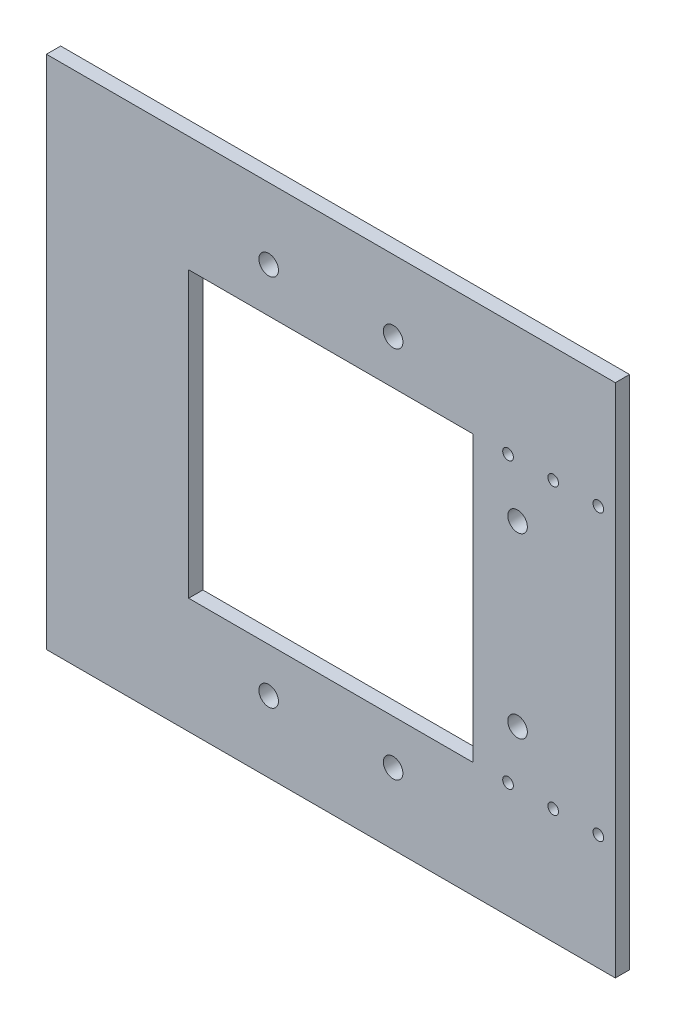
ISO-10303-21;
HEADER;
FILE_DESCRIPTION(('STEP AP214'),'2;1');
FILE_NAME('part.step','',(''),(''),'','','');
FILE_SCHEMA(('AUTOMOTIVE_DESIGN { 1 0 10303 214 1 1 1 1 }'));
ENDSEC;
DATA;
#1=APPLICATION_CONTEXT('core data for automotive mechanical design processes');
#2=APPLICATION_PROTOCOL_DEFINITION('international standard','automotive_design',2000,#1);
#3=PRODUCT_CONTEXT('',#1,'mechanical');
#4=PRODUCT('Part','Part','',(#3));
#5=PRODUCT_RELATED_PRODUCT_CATEGORY('part','',(#4));
#6=PRODUCT_DEFINITION_FORMATION('','',#4);
#7=PRODUCT_DEFINITION_CONTEXT('part definition',#1,'design');
#8=PRODUCT_DEFINITION('design','',#6,#7);
#9=PRODUCT_DEFINITION_SHAPE('','',#8);
#10=(LENGTH_UNIT() NAMED_UNIT(*) SI_UNIT(.MILLI.,.METRE.));
#11=(NAMED_UNIT(*) PLANE_ANGLE_UNIT() SI_UNIT($,.RADIAN.));
#12=(NAMED_UNIT(*) SI_UNIT($,.STERADIAN.) SOLID_ANGLE_UNIT());
#13=UNCERTAINTY_MEASURE_WITH_UNIT(LENGTH_MEASURE(1.E-05),#10,'distance_accuracy_value','');
#14=(GEOMETRIC_REPRESENTATION_CONTEXT(3) GLOBAL_UNCERTAINTY_ASSIGNED_CONTEXT((#13)) GLOBAL_UNIT_ASSIGNED_CONTEXT((#10,
#11,#12)) REPRESENTATION_CONTEXT('',''));
#15=CARTESIAN_POINT('',(0.,0.,0.));
#16=DIRECTION('',(0.,0.,1.));
#17=DIRECTION('',(1.,0.,0.));
#18=AXIS2_PLACEMENT_3D('',#15,#16,#17);
#19=CARTESIAN_POINT('',(95.55,-41.274,-0.01));
#20=DIRECTION('',(0.,0.,1.));
#21=DIRECTION('',(1.,0.,0.));
#22=AXIS2_PLACEMENT_3D('',#19,#20,#21);
#23=CYLINDRICAL_SURFACE('',#22,1.1);
#24=DIRECTION('',(0.,0.,1.));
#25=VECTOR('',#24,1.);
#26=CARTESIAN_POINT('',(96.65,-41.274,-0.01));
#27=LINE('',#26,#25);
#28=CARTESIAN_POINT('',(96.65,-41.274,0.));
#29=VERTEX_POINT('',#28);
#30=CARTESIAN_POINT('',(96.65,-41.274,1.6));
#31=VERTEX_POINT('',#30);
#32=EDGE_CURVE('E11',#29,#31,#27,.T.);
#33=ORIENTED_EDGE('',*,*,#32,.F.);
#34=CARTESIAN_POINT('',(95.55,-41.274,0.));
#35=DIRECTION('',(0.,0.,1.));
#36=DIRECTION('',(1.,0.,0.));
#37=AXIS2_PLACEMENT_3D('',#34,#35,#36);
#38=CIRCLE('',#37,1.1);
#39=EDGE_CURVE('E224',#29,#29,#38,.T.);
#40=ORIENTED_EDGE('',*,*,#39,.F.);
#41=ORIENTED_EDGE('',*,*,#32,.T.);
#42=CARTESIAN_POINT('',(95.55,-41.274,1.6));
#43=DIRECTION('',(0.,0.,1.));
#44=DIRECTION('',(1.,0.,0.));
#45=AXIS2_PLACEMENT_3D('',#42,#43,#44);
#46=CIRCLE('',#45,1.1);
#47=EDGE_CURVE('E334',#31,#31,#46,.T.);
#48=ORIENTED_EDGE('',*,*,#47,.T.);
#49=EDGE_LOOP('',(#33,#40,#41,#48));
#50=FACE_BOUND('',#49,.T.);
#51=ADVANCED_FACE('F17',(#50),#23,.F.);
#52=CARTESIAN_POINT('',(109.55,-41.274,-0.01));
#53=DIRECTION('',(0.,0.,1.));
#54=DIRECTION('',(1.,0.,0.));
#55=AXIS2_PLACEMENT_3D('',#52,#53,#54);
#56=CYLINDRICAL_SURFACE('',#55,1.1);
#57=DIRECTION('',(0.,0.,1.));
#58=VECTOR('',#57,1.);
#59=CARTESIAN_POINT('',(110.65,-41.274,-0.01));
#60=LINE('',#59,#58);
#61=CARTESIAN_POINT('',(110.65,-41.274,0.));
#62=VERTEX_POINT('',#61);
#63=CARTESIAN_POINT('',(110.65,-41.274,1.6));
#64=VERTEX_POINT('',#63);
#65=EDGE_CURVE('E28',#62,#64,#60,.T.);
#66=ORIENTED_EDGE('',*,*,#65,.F.);
#67=CARTESIAN_POINT('',(109.55,-41.274,0.));
#68=DIRECTION('',(0.,0.,1.));
#69=DIRECTION('',(1.,0.,0.));
#70=AXIS2_PLACEMENT_3D('',#67,#68,#69);
#71=CIRCLE('',#70,1.1);
#72=EDGE_CURVE('E221',#62,#62,#71,.T.);
#73=ORIENTED_EDGE('',*,*,#72,.F.);
#74=ORIENTED_EDGE('',*,*,#65,.T.);
#75=CARTESIAN_POINT('',(109.55,-41.274,1.6));
#76=DIRECTION('',(0.,0.,1.));
#77=DIRECTION('',(1.,0.,0.));
#78=AXIS2_PLACEMENT_3D('',#75,#76,#77);
#79=CIRCLE('',#78,1.1);
#80=EDGE_CURVE('E378',#64,#64,#79,.T.);
#81=ORIENTED_EDGE('',*,*,#80,.T.);
#82=EDGE_LOOP('',(#66,#73,#74,#81));
#83=FACE_BOUND('',#82,.T.);
#84=ADVANCED_FACE('F442',(#83),#56,.F.);
#85=CARTESIAN_POINT('',(86.55,-78.274,0.));
#86=DIRECTION('',(0.,1.,0.));
#87=DIRECTION('',(1.,0.,0.));
#88=AXIS2_PLACEMENT_3D('',#85,#86,#87);
#89=PLANE('',#88);
#90=DIRECTION('',(0.,0.,1.));
#91=VECTOR('',#90,1.);
#92=CARTESIAN_POINT('',(86.55,-78.274,0.));
#93=LINE('',#92,#91);
#94=CARTESIAN_POINT('',(86.55,-78.274,0.));
#95=VERTEX_POINT('',#94);
#96=CARTESIAN_POINT('',(86.55,-78.274,1.6));
#97=VERTEX_POINT('',#96);
#98=EDGE_CURVE('E255',#95,#97,#93,.T.);
#99=ORIENTED_EDGE('',*,*,#98,.T.);
#100=DIRECTION('',(1.,0.,0.));
#101=VECTOR('',#100,1.);
#102=CARTESIAN_POINT('',(86.55,-78.274,1.6));
#103=LINE('',#102,#101);
#104=CARTESIAN_POINT('',(118.55,-78.274,1.6));
#105=VERTEX_POINT('',#104);
#106=EDGE_CURVE('E283',#97,#105,#103,.T.);
#107=ORIENTED_EDGE('',*,*,#106,.T.);
#108=DIRECTION('',(0.,0.,1.));
#109=VECTOR('',#108,1.);
#110=CARTESIAN_POINT('',(118.55,-78.274,0.));
#111=LINE('',#110,#109);
#112=CARTESIAN_POINT('',(118.55,-78.274,0.));
#113=VERTEX_POINT('',#112);
#114=EDGE_CURVE('E254',#113,#105,#111,.T.);
#115=ORIENTED_EDGE('',*,*,#114,.F.);
#116=DIRECTION('',(1.,0.,0.));
#117=VECTOR('',#116,1.);
#118=CARTESIAN_POINT('',(86.55,-78.274,0.));
#119=LINE('',#118,#117);
#120=EDGE_CURVE('E375',#95,#113,#119,.T.);
#121=ORIENTED_EDGE('',*,*,#120,.F.);
#122=EDGE_LOOP('',(#99,#107,#115,#121));
#123=FACE_BOUND('',#122,.T.);
#124=ADVANCED_FACE('F406',(#123),#89,.T.);
#125=CARTESIAN_POINT('',(118.55,-78.274,0.));
#126=DIRECTION('',(-1.,0.,0.));
#127=DIRECTION('',(0.,0.,1.));
#128=AXIS2_PLACEMENT_3D('',#125,#126,#127);
#129=PLANE('',#128);
#130=ORIENTED_EDGE('',*,*,#114,.T.);
#131=DIRECTION('',(0.,1.,0.));
#132=VECTOR('',#131,1.);
#133=CARTESIAN_POINT('',(118.55,-78.274,1.6));
#134=LINE('',#133,#132);
#135=CARTESIAN_POINT('',(118.55,-46.274,1.6));
#136=VERTEX_POINT('',#135);
#137=EDGE_CURVE('E286',#105,#136,#134,.T.);
#138=ORIENTED_EDGE('',*,*,#137,.T.);
#139=DIRECTION('',(0.,0.,1.));
#140=VECTOR('',#139,1.);
#141=CARTESIAN_POINT('',(118.55,-46.274,0.));
#142=LINE('',#141,#140);
#143=CARTESIAN_POINT('',(118.55,-46.274,0.));
#144=VERTEX_POINT('',#143);
#145=EDGE_CURVE('E72',#144,#136,#142,.T.);
#146=ORIENTED_EDGE('',*,*,#145,.F.);
#147=DIRECTION('',(0.,1.,0.));
#148=VECTOR('',#147,1.);
#149=CARTESIAN_POINT('',(118.55,-78.274,0.));
#150=LINE('',#149,#148);
#151=EDGE_CURVE('E371',#113,#144,#150,.T.);
#152=ORIENTED_EDGE('',*,*,#151,.F.);
#153=EDGE_LOOP('',(#130,#138,#146,#152));
#154=FACE_BOUND('',#153,.T.);
#155=ADVANCED_FACE('F408',(#154),#129,.T.);
#156=CARTESIAN_POINT('',(118.55,-46.274,0.));
#157=DIRECTION('',(0.,-1.,0.));
#158=DIRECTION('',(0.,0.,-1.));
#159=AXIS2_PLACEMENT_3D('',#156,#157,#158);
#160=PLANE('',#159);
#161=ORIENTED_EDGE('',*,*,#145,.T.);
#162=DIRECTION('',(-1.,0.,0.));
#163=VECTOR('',#162,1.);
#164=CARTESIAN_POINT('',(118.55,-46.274,1.6));
#165=LINE('',#164,#163);
#166=CARTESIAN_POINT('',(86.55,-46.274,1.6));
#167=VERTEX_POINT('',#166);
#168=EDGE_CURVE('E230',#136,#167,#165,.T.);
#169=ORIENTED_EDGE('',*,*,#168,.T.);
#170=DIRECTION('',(0.,0.,1.));
#171=VECTOR('',#170,1.);
#172=CARTESIAN_POINT('',(86.55,-46.274,0.));
#173=LINE('',#172,#171);
#174=CARTESIAN_POINT('',(86.55,-46.274,0.));
#175=VERTEX_POINT('',#174);
#176=EDGE_CURVE('E263',#175,#167,#173,.T.);
#177=ORIENTED_EDGE('',*,*,#176,.F.);
#178=DIRECTION('',(-1.,0.,0.));
#179=VECTOR('',#178,1.);
#180=CARTESIAN_POINT('',(118.55,-46.274,0.));
#181=LINE('',#180,#179);
#182=EDGE_CURVE('E225',#144,#175,#181,.T.);
#183=ORIENTED_EDGE('',*,*,#182,.F.);
#184=EDGE_LOOP('',(#161,#169,#177,#183));
#185=FACE_BOUND('',#184,.T.);
#186=ADVANCED_FACE('F450',(#185),#160,.T.);
#187=CARTESIAN_POINT('',(86.55,-46.274,0.));
#188=DIRECTION('',(1.,0.,0.));
#189=DIRECTION('',(0.,1.,0.));
#190=AXIS2_PLACEMENT_3D('',#187,#188,#189);
#191=PLANE('',#190);
#192=ORIENTED_EDGE('',*,*,#176,.T.);
#193=DIRECTION('',(0.,-1.,0.));
#194=VECTOR('',#193,1.);
#195=CARTESIAN_POINT('',(86.55,-46.274,1.6));
#196=LINE('',#195,#194);
#197=EDGE_CURVE('E277',#167,#97,#196,.T.);
#198=ORIENTED_EDGE('',*,*,#197,.T.);
#199=ORIENTED_EDGE('',*,*,#98,.F.);
#200=DIRECTION('',(0.,-1.,0.));
#201=VECTOR('',#200,1.);
#202=CARTESIAN_POINT('',(86.55,-46.274,0.));
#203=LINE('',#202,#201);
#204=EDGE_CURVE('E354',#175,#95,#203,.T.);
#205=ORIENTED_EDGE('',*,*,#204,.F.);
#206=EDGE_LOOP('',(#192,#198,#199,#205));
#207=FACE_BOUND('',#206,.T.);
#208=ADVANCED_FACE('F399',(#207),#191,.T.);
#209=CARTESIAN_POINT('',(122.4788,-46.2788,-0.01));
#210=DIRECTION('',(0.,0.,1.));
#211=DIRECTION('',(1.,0.,0.));
#212=AXIS2_PLACEMENT_3D('',#209,#210,#211);
#213=CYLINDRICAL_SURFACE('',#212,0.6);
#214=DIRECTION('',(0.,0.,1.));
#215=VECTOR('',#214,1.);
#216=CARTESIAN_POINT('',(123.0788,-46.2788,-0.01));
#217=LINE('',#216,#215);
#218=CARTESIAN_POINT('',(123.0788,-46.2788,0.));
#219=VERTEX_POINT('',#218);
#220=CARTESIAN_POINT('',(123.0788,-46.2788,1.6));
#221=VERTEX_POINT('',#220);
#222=EDGE_CURVE('E273',#219,#221,#217,.T.);
#223=ORIENTED_EDGE('',*,*,#222,.F.);
#224=CARTESIAN_POINT('',(122.4788,-46.2788,0.));
#225=DIRECTION('',(0.,0.,1.));
#226=DIRECTION('',(1.,0.,0.));
#227=AXIS2_PLACEMENT_3D('',#224,#225,#226);
#228=CIRCLE('',#227,0.6);
#229=EDGE_CURVE('E350',#219,#219,#228,.T.);
#230=ORIENTED_EDGE('',*,*,#229,.F.);
#231=ORIENTED_EDGE('',*,*,#222,.T.);
#232=CARTESIAN_POINT('',(122.4788,-46.2788,1.6));
#233=DIRECTION('',(0.,0.,1.));
#234=DIRECTION('',(1.,0.,0.));
#235=AXIS2_PLACEMENT_3D('',#232,#233,#234);
#236=CIRCLE('',#235,0.6);
#237=EDGE_CURVE('E226',#221,#221,#236,.T.);
#238=ORIENTED_EDGE('',*,*,#237,.T.);
#239=EDGE_LOOP('',(#223,#230,#231,#238));
#240=FACE_BOUND('',#239,.T.);
#241=ADVANCED_FACE('F478',(#240),#213,.F.);
#242=CARTESIAN_POINT('',(127.5588,-46.2788,-0.01));
#243=DIRECTION('',(0.,0.,1.));
#244=DIRECTION('',(1.,0.,0.));
#245=AXIS2_PLACEMENT_3D('',#242,#243,#244);
#246=CYLINDRICAL_SURFACE('',#245,0.6);
#247=DIRECTION('',(0.,0.,1.));
#248=VECTOR('',#247,1.);
#249=CARTESIAN_POINT('',(128.1588,-46.2788,-0.01));
#250=LINE('',#249,#248);
#251=CARTESIAN_POINT('',(128.1588,-46.2788,0.));
#252=VERTEX_POINT('',#251);
#253=CARTESIAN_POINT('',(128.1588,-46.2788,1.6));
#254=VERTEX_POINT('',#253);
#255=EDGE_CURVE('E326',#252,#254,#250,.T.);
#256=ORIENTED_EDGE('',*,*,#255,.F.);
#257=CARTESIAN_POINT('',(127.5588,-46.2788,0.));
#258=DIRECTION('',(0.,0.,1.));
#259=DIRECTION('',(1.,0.,0.));
#260=AXIS2_PLACEMENT_3D('',#257,#258,#259);
#261=CIRCLE('',#260,0.6);
#262=EDGE_CURVE('E338',#252,#252,#261,.T.);
#263=ORIENTED_EDGE('',*,*,#262,.F.);
#264=ORIENTED_EDGE('',*,*,#255,.T.);
#265=CARTESIAN_POINT('',(127.5588,-46.2788,1.6));
#266=DIRECTION('',(0.,0.,1.));
#267=DIRECTION('',(1.,0.,0.));
#268=AXIS2_PLACEMENT_3D('',#265,#266,#267);
#269=CIRCLE('',#268,0.6);
#270=EDGE_CURVE('E231',#254,#254,#269,.T.);
#271=ORIENTED_EDGE('',*,*,#270,.T.);
#272=EDGE_LOOP('',(#256,#263,#264,#271));
#273=FACE_BOUND('',#272,.T.);
#274=ADVANCED_FACE('F473',(#273),#246,.F.);
#275=CARTESIAN_POINT('',(132.6388,-46.2788,-0.01));
#276=DIRECTION('',(0.,0.,1.));
#277=DIRECTION('',(1.,0.,0.));
#278=AXIS2_PLACEMENT_3D('',#275,#276,#277);
#279=CYLINDRICAL_SURFACE('',#278,0.6);
#280=DIRECTION('',(0.,0.,1.));
#281=VECTOR('',#280,1.);
#282=CARTESIAN_POINT('',(133.2388,-46.2788,-0.01));
#283=LINE('',#282,#281);
#284=CARTESIAN_POINT('',(133.2388,-46.2788,0.));
#285=VERTEX_POINT('',#284);
#286=CARTESIAN_POINT('',(133.2388,-46.2788,1.6));
#287=VERTEX_POINT('',#286);
#288=EDGE_CURVE('E315',#285,#287,#283,.T.);
#289=ORIENTED_EDGE('',*,*,#288,.F.);
#290=CARTESIAN_POINT('',(132.6388,-46.2788,0.));
#291=DIRECTION('',(0.,0.,1.));
#292=DIRECTION('',(1.,0.,0.));
#293=AXIS2_PLACEMENT_3D('',#290,#291,#292);
#294=CIRCLE('',#293,0.6);
#295=EDGE_CURVE('E236',#285,#285,#294,.T.);
#296=ORIENTED_EDGE('',*,*,#295,.F.);
#297=ORIENTED_EDGE('',*,*,#288,.T.);
#298=CARTESIAN_POINT('',(132.6388,-46.2788,1.6));
#299=DIRECTION('',(0.,0.,1.));
#300=DIRECTION('',(1.,0.,0.));
#301=AXIS2_PLACEMENT_3D('',#298,#299,#300);
#302=CIRCLE('',#301,0.6);
#303=EDGE_CURVE('E347',#287,#287,#302,.T.);
#304=ORIENTED_EDGE('',*,*,#303,.T.);
#305=EDGE_LOOP('',(#289,#296,#297,#304));
#306=FACE_BOUND('',#305,.T.);
#307=ADVANCED_FACE('F469',(#306),#279,.F.);
#308=CARTESIAN_POINT('',(123.55,-52.274,-0.01));
#309=DIRECTION('',(0.,0.,1.));
#310=DIRECTION('',(1.,0.,0.));
#311=AXIS2_PLACEMENT_3D('',#308,#309,#310);
#312=CYLINDRICAL_SURFACE('',#311,1.1);
#313=DIRECTION('',(0.,0.,1.));
#314=VECTOR('',#313,1.);
#315=CARTESIAN_POINT('',(124.65,-52.274,-0.01));
#316=LINE('',#315,#314);
#317=CARTESIAN_POINT('',(124.65,-52.274,0.));
#318=VERTEX_POINT('',#317);
#319=CARTESIAN_POINT('',(124.65,-52.274,1.6));
#320=VERTEX_POINT('',#319);
#321=EDGE_CURVE('E251',#318,#320,#316,.T.);
#322=ORIENTED_EDGE('',*,*,#321,.F.);
#323=CARTESIAN_POINT('',(123.55,-52.274,0.));
#324=DIRECTION('',(0.,0.,1.));
#325=DIRECTION('',(1.,0.,0.));
#326=AXIS2_PLACEMENT_3D('',#323,#324,#325);
#327=CIRCLE('',#326,1.1);
#328=EDGE_CURVE('E232',#318,#318,#327,.T.);
#329=ORIENTED_EDGE('',*,*,#328,.F.);
#330=ORIENTED_EDGE('',*,*,#321,.T.);
#331=CARTESIAN_POINT('',(123.55,-52.274,1.6));
#332=DIRECTION('',(0.,0.,1.));
#333=DIRECTION('',(1.,0.,0.));
#334=AXIS2_PLACEMENT_3D('',#331,#332,#333);
#335=CIRCLE('',#334,1.1);
#336=EDGE_CURVE('E242',#320,#320,#335,.T.);
#337=ORIENTED_EDGE('',*,*,#336,.T.);
#338=EDGE_LOOP('',(#322,#329,#330,#337));
#339=FACE_BOUND('',#338,.T.);
#340=ADVANCED_FACE('F472',(#339),#312,.F.);
#341=CARTESIAN_POINT('',(95.55,-83.274,-0.01));
#342=DIRECTION('',(0.,0.,1.));
#343=DIRECTION('',(1.,0.,0.));
#344=AXIS2_PLACEMENT_3D('',#341,#342,#343);
#345=CYLINDRICAL_SURFACE('',#344,1.1);
#346=DIRECTION('',(0.,0.,1.));
#347=VECTOR('',#346,1.);
#348=CARTESIAN_POINT('',(96.65,-83.274,-0.01));
#349=LINE('',#348,#347);
#350=CARTESIAN_POINT('',(96.65,-83.274,0.));
#351=VERTEX_POINT('',#350);
#352=CARTESIAN_POINT('',(96.65,-83.274,1.6));
#353=VERTEX_POINT('',#352);
#354=EDGE_CURVE('E249',#351,#353,#349,.T.);
#355=ORIENTED_EDGE('',*,*,#354,.F.);
#356=CARTESIAN_POINT('',(95.55,-83.274,0.));
#357=DIRECTION('',(0.,0.,1.));
#358=DIRECTION('',(1.,0.,0.));
#359=AXIS2_PLACEMENT_3D('',#356,#357,#358);
#360=CIRCLE('',#359,1.1);
#361=EDGE_CURVE('E237',#351,#351,#360,.T.);
#362=ORIENTED_EDGE('',*,*,#361,.F.);
#363=ORIENTED_EDGE('',*,*,#354,.T.);
#364=CARTESIAN_POINT('',(95.55,-83.274,1.6));
#365=DIRECTION('',(0.,0.,1.));
#366=DIRECTION('',(1.,0.,0.));
#367=AXIS2_PLACEMENT_3D('',#364,#365,#366);
#368=CIRCLE('',#367,1.1);
#369=EDGE_CURVE('E238',#353,#353,#368,.T.);
#370=ORIENTED_EDGE('',*,*,#369,.T.);
#371=EDGE_LOOP('',(#355,#362,#363,#370));
#372=FACE_BOUND('',#371,.T.);
#373=ADVANCED_FACE('F467',(#372),#345,.F.);
#374=CARTESIAN_POINT('',(109.55,-83.274,-0.01));
#375=DIRECTION('',(0.,0.,1.));
#376=DIRECTION('',(1.,0.,0.));
#377=AXIS2_PLACEMENT_3D('',#374,#375,#376);
#378=CYLINDRICAL_SURFACE('',#377,1.1);
#379=DIRECTION('',(0.,0.,1.));
#380=VECTOR('',#379,1.);
#381=CARTESIAN_POINT('',(110.65,-83.274,-0.01));
#382=LINE('',#381,#380);
#383=CARTESIAN_POINT('',(110.65,-83.274,0.));
#384=VERTEX_POINT('',#383);
#385=CARTESIAN_POINT('',(110.65,-83.274,1.6));
#386=VERTEX_POINT('',#385);
#387=EDGE_CURVE('E252',#384,#386,#382,.T.);
#388=ORIENTED_EDGE('',*,*,#387,.F.);
#389=CARTESIAN_POINT('',(109.55,-83.274,0.));
#390=DIRECTION('',(0.,0.,1.));
#391=DIRECTION('',(1.,0.,0.));
#392=AXIS2_PLACEMENT_3D('',#389,#390,#391);
#393=CIRCLE('',#392,1.1);
#394=EDGE_CURVE('E311',#384,#384,#393,.T.);
#395=ORIENTED_EDGE('',*,*,#394,.F.);
#396=ORIENTED_EDGE('',*,*,#387,.T.);
#397=CARTESIAN_POINT('',(109.55,-83.274,1.6));
#398=DIRECTION('',(0.,0.,1.));
#399=DIRECTION('',(1.,0.,0.));
#400=AXIS2_PLACEMENT_3D('',#397,#398,#399);
#401=CIRCLE('',#400,1.1);
#402=EDGE_CURVE('E243',#386,#386,#401,.T.);
#403=ORIENTED_EDGE('',*,*,#402,.T.);
#404=EDGE_LOOP('',(#388,#395,#396,#403));
#405=FACE_BOUND('',#404,.T.);
#406=ADVANCED_FACE('F463',(#405),#378,.F.);
#407=CARTESIAN_POINT('',(123.55,-72.274,-0.01));
#408=DIRECTION('',(0.,0.,1.));
#409=DIRECTION('',(1.,0.,0.));
#410=AXIS2_PLACEMENT_3D('',#407,#408,#409);
#411=CYLINDRICAL_SURFACE('',#410,1.1);
#412=DIRECTION('',(0.,0.,1.));
#413=VECTOR('',#412,1.);
#414=CARTESIAN_POINT('',(124.65,-72.274,-0.01));
#415=LINE('',#414,#413);
#416=CARTESIAN_POINT('',(124.65,-72.274,0.));
#417=VERTEX_POINT('',#416);
#418=CARTESIAN_POINT('',(124.65,-72.274,1.6));
#419=VERTEX_POINT('',#418);
#420=EDGE_CURVE('E281',#417,#419,#415,.T.);
#421=ORIENTED_EDGE('',*,*,#420,.F.);
#422=CARTESIAN_POINT('',(123.55,-72.274,0.));
#423=DIRECTION('',(0.,0.,1.));
#424=DIRECTION('',(1.,0.,0.));
#425=AXIS2_PLACEMENT_3D('',#422,#423,#424);
#426=CIRCLE('',#425,1.1);
#427=EDGE_CURVE('E364',#417,#417,#426,.T.);
#428=ORIENTED_EDGE('',*,*,#427,.F.);
#429=ORIENTED_EDGE('',*,*,#420,.T.);
#430=CARTESIAN_POINT('',(123.55,-72.274,1.6));
#431=DIRECTION('',(0.,0.,1.));
#432=DIRECTION('',(1.,0.,0.));
#433=AXIS2_PLACEMENT_3D('',#430,#431,#432);
#434=CIRCLE('',#433,1.1);
#435=EDGE_CURVE('E306',#419,#419,#434,.T.);
#436=ORIENTED_EDGE('',*,*,#435,.T.);
#437=EDGE_LOOP('',(#421,#428,#429,#436));
#438=FACE_BOUND('',#437,.T.);
#439=ADVANCED_FACE('F459',(#438),#411,.F.);
#440=CARTESIAN_POINT('',(122.4788,-78.2828,-0.01));
#441=DIRECTION('',(0.,0.,1.));
#442=DIRECTION('',(1.,0.,0.));
#443=AXIS2_PLACEMENT_3D('',#440,#441,#442);
#444=CYLINDRICAL_SURFACE('',#443,0.6);
#445=DIRECTION('',(0.,0.,1.));
#446=VECTOR('',#445,1.);
#447=CARTESIAN_POINT('',(123.0788,-78.2828,-0.01));
#448=LINE('',#447,#446);
#449=CARTESIAN_POINT('',(123.0788,-78.2828,0.));
#450=VERTEX_POINT('',#449);
#451=CARTESIAN_POINT('',(123.0788,-78.2828,1.6));
#452=VERTEX_POINT('',#451);
#453=EDGE_CURVE('E279',#450,#452,#448,.T.);
#454=ORIENTED_EDGE('',*,*,#453,.F.);
#455=CARTESIAN_POINT('',(122.4788,-78.2828,0.));
#456=DIRECTION('',(0.,0.,1.));
#457=DIRECTION('',(1.,0.,0.));
#458=AXIS2_PLACEMENT_3D('',#455,#456,#457);
#459=CIRCLE('',#458,0.6);
#460=EDGE_CURVE('E331',#450,#450,#459,.T.);
#461=ORIENTED_EDGE('',*,*,#460,.F.);
#462=ORIENTED_EDGE('',*,*,#453,.T.);
#463=CARTESIAN_POINT('',(122.4788,-78.2828,1.6));
#464=DIRECTION('',(0.,0.,1.));
#465=DIRECTION('',(1.,0.,0.));
#466=AXIS2_PLACEMENT_3D('',#463,#464,#465);
#467=CIRCLE('',#466,0.6);
#468=EDGE_CURVE('E295',#452,#452,#467,.T.);
#469=ORIENTED_EDGE('',*,*,#468,.T.);
#470=EDGE_LOOP('',(#454,#461,#462,#469));
#471=FACE_BOUND('',#470,.T.);
#472=ADVANCED_FACE('F462',(#471),#444,.F.);
#473=CARTESIAN_POINT('',(127.5588,-78.2828,-0.01));
#474=DIRECTION('',(0.,0.,1.));
#475=DIRECTION('',(1.,0.,0.));
#476=AXIS2_PLACEMENT_3D('',#473,#474,#475);
#477=CYLINDRICAL_SURFACE('',#476,0.6);
#478=DIRECTION('',(0.,0.,1.));
#479=VECTOR('',#478,1.);
#480=CARTESIAN_POINT('',(128.1588,-78.2828,-0.01));
#481=LINE('',#480,#479);
#482=CARTESIAN_POINT('',(128.1588,-78.2828,0.));
#483=VERTEX_POINT('',#482);
#484=CARTESIAN_POINT('',(128.1588,-78.2828,1.6));
#485=VERTEX_POINT('',#484);
#486=EDGE_CURVE('E282',#483,#485,#481,.T.);
#487=ORIENTED_EDGE('',*,*,#486,.F.);
#488=CARTESIAN_POINT('',(127.5588,-78.2828,0.));
#489=DIRECTION('',(0.,0.,1.));
#490=DIRECTION('',(1.,0.,0.));
#491=AXIS2_PLACEMENT_3D('',#488,#489,#490);
#492=CIRCLE('',#491,0.6);
#493=EDGE_CURVE('E327',#483,#483,#492,.T.);
#494=ORIENTED_EDGE('',*,*,#493,.F.);
#495=ORIENTED_EDGE('',*,*,#486,.T.);
#496=CARTESIAN_POINT('',(127.5588,-78.2828,1.6));
#497=DIRECTION('',(0.,0.,1.));
#498=DIRECTION('',(1.,0.,0.));
#499=AXIS2_PLACEMENT_3D('',#496,#497,#498);
#500=CIRCLE('',#499,0.6);
#501=EDGE_CURVE('E291',#485,#485,#500,.T.);
#502=ORIENTED_EDGE('',*,*,#501,.T.);
#503=EDGE_LOOP('',(#487,#494,#495,#502));
#504=FACE_BOUND('',#503,.T.);
#505=ADVANCED_FACE('F484',(#504),#477,.F.);
#506=CARTESIAN_POINT('',(132.6388,-78.2828,-0.01));
#507=DIRECTION('',(0.,0.,1.));
#508=DIRECTION('',(1.,0.,0.));
#509=AXIS2_PLACEMENT_3D('',#506,#507,#508);
#510=CYLINDRICAL_SURFACE('',#509,0.6);
#511=DIRECTION('',(0.,0.,1.));
#512=VECTOR('',#511,1.);
#513=CARTESIAN_POINT('',(133.2388,-78.2828,-0.01));
#514=LINE('',#513,#512);
#515=CARTESIAN_POINT('',(133.2388,-78.2828,0.));
#516=VERTEX_POINT('',#515);
#517=CARTESIAN_POINT('',(133.2388,-78.2828,1.6));
#518=VERTEX_POINT('',#517);
#519=EDGE_CURVE('E318',#516,#518,#514,.T.);
#520=ORIENTED_EDGE('',*,*,#519,.F.);
#521=CARTESIAN_POINT('',(132.6388,-78.2828,0.));
#522=DIRECTION('',(0.,0.,1.));
#523=DIRECTION('',(1.,0.,0.));
#524=AXIS2_PLACEMENT_3D('',#521,#522,#523);
#525=CIRCLE('',#524,0.6);
#526=EDGE_CURVE('E21',#516,#516,#525,.T.);
#527=ORIENTED_EDGE('',*,*,#526,.F.);
#528=ORIENTED_EDGE('',*,*,#519,.T.);
#529=CARTESIAN_POINT('',(132.6388,-78.2828,1.6));
#530=DIRECTION('',(0.,0.,1.));
#531=DIRECTION('',(1.,0.,0.));
#532=AXIS2_PLACEMENT_3D('',#529,#530,#531);
#533=CIRCLE('',#532,0.6);
#534=EDGE_CURVE('E290',#518,#518,#533,.T.);
#535=ORIENTED_EDGE('',*,*,#534,.T.);
#536=EDGE_LOOP('',(#520,#527,#528,#535));
#537=FACE_BOUND('',#536,.T.);
#538=ADVANCED_FACE('F438',(#537),#510,.F.);
#539=CARTESIAN_POINT('',(70.55,-33.274,0.));
#540=DIRECTION('',(0.,1.,0.));
#541=DIRECTION('',(1.,0.,0.));
#542=AXIS2_PLACEMENT_3D('',#539,#540,#541);
#543=PLANE('',#542);
#544=DIRECTION('',(0.,0.,1.));
#545=VECTOR('',#544,1.);
#546=CARTESIAN_POINT('',(70.55,-33.274,0.));
#547=LINE('',#546,#545);
#548=CARTESIAN_POINT('',(70.55,-33.274,0.));
#549=VERTEX_POINT('',#548);
#550=CARTESIAN_POINT('',(70.55,-33.274,1.6));
#551=VERTEX_POINT('',#550);
#552=EDGE_CURVE('E189',#549,#551,#547,.T.);
#553=ORIENTED_EDGE('',*,*,#552,.T.);
#554=DIRECTION('',(1.,0.,0.));
#555=VECTOR('',#554,1.);
#556=CARTESIAN_POINT('',(70.55,-33.274,1.6));
#557=LINE('',#556,#555);
#558=CARTESIAN_POINT('',(134.55,-33.274,1.6));
#559=VERTEX_POINT('',#558);
#560=EDGE_CURVE('E287',#551,#559,#557,.T.);
#561=ORIENTED_EDGE('',*,*,#560,.T.);
#562=DIRECTION('',(0.,0.,1.));
#563=VECTOR('',#562,1.);
#564=CARTESIAN_POINT('',(134.55,-33.274,0.));
#565=LINE('',#564,#563);
#566=CARTESIAN_POINT('',(134.55,-33.274,0.));
#567=VERTEX_POINT('',#566);
#568=EDGE_CURVE('E192',#567,#559,#565,.T.);
#569=ORIENTED_EDGE('',*,*,#568,.F.);
#570=DIRECTION('',(1.,0.,0.));
#571=VECTOR('',#570,1.);
#572=CARTESIAN_POINT('',(70.55,-33.274,0.));
#573=LINE('',#572,#571);
#574=EDGE_CURVE('E186',#549,#567,#573,.T.);
#575=ORIENTED_EDGE('',*,*,#574,.F.);
#576=EDGE_LOOP('',(#553,#561,#569,#575));
#577=FACE_BOUND('',#576,.T.);
#578=ADVANCED_FACE('F19',(#577),#543,.T.);
#579=CARTESIAN_POINT('',(102.55,-62.274,1.6));
#580=DIRECTION('',(0.,0.,-1.));
#581=DIRECTION('',(0.,-1.,0.));
#582=AXIS2_PLACEMENT_3D('',#579,#580,#581);
#583=PLANE('',#582);
#584=ORIENTED_EDGE('',*,*,#47,.F.);
#585=EDGE_LOOP('',(#584));
#586=FACE_BOUND('',#585,.T.);
#587=ORIENTED_EDGE('',*,*,#80,.F.);
#588=EDGE_LOOP('',(#587));
#589=FACE_BOUND('',#588,.T.);
#590=ORIENTED_EDGE('',*,*,#168,.F.);
#591=ORIENTED_EDGE('',*,*,#137,.F.);
#592=ORIENTED_EDGE('',*,*,#106,.F.);
#593=ORIENTED_EDGE('',*,*,#197,.F.);
#594=EDGE_LOOP('',(#590,#591,#592,#593));
#595=FACE_BOUND('',#594,.T.);
#596=ORIENTED_EDGE('',*,*,#237,.F.);
#597=EDGE_LOOP('',(#596));
#598=FACE_BOUND('',#597,.T.);
#599=ORIENTED_EDGE('',*,*,#270,.F.);
#600=EDGE_LOOP('',(#599));
#601=FACE_BOUND('',#600,.T.);
#602=ORIENTED_EDGE('',*,*,#303,.F.);
#603=EDGE_LOOP('',(#602));
#604=FACE_BOUND('',#603,.T.);
#605=ORIENTED_EDGE('',*,*,#336,.F.);
#606=EDGE_LOOP('',(#605));
#607=FACE_BOUND('',#606,.T.);
#608=ORIENTED_EDGE('',*,*,#369,.F.);
#609=EDGE_LOOP('',(#608));
#610=FACE_BOUND('',#609,.T.);
#611=ORIENTED_EDGE('',*,*,#402,.F.);
#612=EDGE_LOOP('',(#611));
#613=FACE_BOUND('',#612,.T.);
#614=ORIENTED_EDGE('',*,*,#435,.F.);
#615=EDGE_LOOP('',(#614));
#616=FACE_BOUND('',#615,.T.);
#617=ORIENTED_EDGE('',*,*,#468,.F.);
#618=EDGE_LOOP('',(#617));
#619=FACE_BOUND('',#618,.T.);
#620=ORIENTED_EDGE('',*,*,#501,.F.);
#621=EDGE_LOOP('',(#620));
#622=FACE_BOUND('',#621,.T.);
#623=ORIENTED_EDGE('',*,*,#534,.F.);
#624=EDGE_LOOP('',(#623));
#625=FACE_BOUND('',#624,.T.);
#626=DIRECTION('',(0.,-1.,0.));
#627=VECTOR('',#626,1.);
#628=CARTESIAN_POINT('',(134.55,-33.274,1.6));
#629=LINE('',#628,#627);
#630=CARTESIAN_POINT('',(134.55,-91.274,1.6));
#631=VERTEX_POINT('',#630);
#632=EDGE_CURVE('E220',#559,#631,#629,.T.);
#633=ORIENTED_EDGE('',*,*,#632,.F.);
#634=ORIENTED_EDGE('',*,*,#560,.F.);
#635=DIRECTION('',(0.,1.,0.));
#636=VECTOR('',#635,1.);
#637=CARTESIAN_POINT('',(70.55,-91.274,1.6));
#638=LINE('',#637,#636);
#639=CARTESIAN_POINT('',(70.55,-91.274,1.6));
#640=VERTEX_POINT('',#639);
#641=EDGE_CURVE('E209',#640,#551,#638,.T.);
#642=ORIENTED_EDGE('',*,*,#641,.F.);
#643=DIRECTION('',(-1.,0.,0.));
#644=VECTOR('',#643,1.);
#645=CARTESIAN_POINT('',(134.55,-91.274,1.6));
#646=LINE('',#645,#644);
#647=EDGE_CURVE('E248',#631,#640,#646,.T.);
#648=ORIENTED_EDGE('',*,*,#647,.F.);
#649=EDGE_LOOP('',(#633,#634,#642,#648));
#650=FACE_BOUND('',#649,.T.);
#651=ADVANCED_FACE('F404',(#586,#589,#595,#598,#601,#604,#607,#610,#613,#616,#619,#622,#625,
#650),#583,.F.);
#652=CARTESIAN_POINT('',(102.55,-62.274,0.));
#653=DIRECTION('',(0.,0.,-1.));
#654=DIRECTION('',(0.,-1.,0.));
#655=AXIS2_PLACEMENT_3D('',#652,#653,#654);
#656=PLANE('',#655);
#657=ORIENTED_EDGE('',*,*,#39,.T.);
#658=EDGE_LOOP('',(#657));
#659=FACE_BOUND('',#658,.T.);
#660=ORIENTED_EDGE('',*,*,#72,.T.);
#661=EDGE_LOOP('',(#660));
#662=FACE_BOUND('',#661,.T.);
#663=ORIENTED_EDGE('',*,*,#204,.T.);
#664=ORIENTED_EDGE('',*,*,#120,.T.);
#665=ORIENTED_EDGE('',*,*,#151,.T.);
#666=ORIENTED_EDGE('',*,*,#182,.T.);
#667=EDGE_LOOP('',(#663,#664,#665,#666));
#668=FACE_BOUND('',#667,.T.);
#669=ORIENTED_EDGE('',*,*,#229,.T.);
#670=EDGE_LOOP('',(#669));
#671=FACE_BOUND('',#670,.T.);
#672=ORIENTED_EDGE('',*,*,#262,.T.);
#673=EDGE_LOOP('',(#672));
#674=FACE_BOUND('',#673,.T.);
#675=ORIENTED_EDGE('',*,*,#295,.T.);
#676=EDGE_LOOP('',(#675));
#677=FACE_BOUND('',#676,.T.);
#678=ORIENTED_EDGE('',*,*,#328,.T.);
#679=EDGE_LOOP('',(#678));
#680=FACE_BOUND('',#679,.T.);
#681=ORIENTED_EDGE('',*,*,#361,.T.);
#682=EDGE_LOOP('',(#681));
#683=FACE_BOUND('',#682,.T.);
#684=ORIENTED_EDGE('',*,*,#394,.T.);
#685=EDGE_LOOP('',(#684));
#686=FACE_BOUND('',#685,.T.);
#687=ORIENTED_EDGE('',*,*,#427,.T.);
#688=EDGE_LOOP('',(#687));
#689=FACE_BOUND('',#688,.T.);
#690=ORIENTED_EDGE('',*,*,#460,.T.);
#691=EDGE_LOOP('',(#690));
#692=FACE_BOUND('',#691,.T.);
#693=ORIENTED_EDGE('',*,*,#493,.T.);
#694=EDGE_LOOP('',(#693));
#695=FACE_BOUND('',#694,.T.);
#696=ORIENTED_EDGE('',*,*,#526,.T.);
#697=EDGE_LOOP('',(#696));
#698=FACE_BOUND('',#697,.T.);
#699=DIRECTION('',(-1.,0.,0.));
#700=VECTOR('',#699,1.);
#701=CARTESIAN_POINT('',(134.55,-91.274,0.));
#702=LINE('',#701,#700);
#703=CARTESIAN_POINT('',(134.55,-91.274,0.));
#704=VERTEX_POINT('',#703);
#705=CARTESIAN_POINT('',(70.55,-91.274,0.));
#706=VERTEX_POINT('',#705);
#707=EDGE_CURVE('E201',#704,#706,#702,.T.);
#708=ORIENTED_EDGE('',*,*,#707,.T.);
#709=DIRECTION('',(0.,1.,0.));
#710=VECTOR('',#709,1.);
#711=CARTESIAN_POINT('',(70.55,-91.274,0.));
#712=LINE('',#711,#710);
#713=EDGE_CURVE('E196',#706,#549,#712,.T.);
#714=ORIENTED_EDGE('',*,*,#713,.T.);
#715=ORIENTED_EDGE('',*,*,#574,.T.);
#716=DIRECTION('',(0.,-1.,0.));
#717=VECTOR('',#716,1.);
#718=CARTESIAN_POINT('',(134.55,-33.274,0.));
#719=LINE('',#718,#717);
#720=EDGE_CURVE('E215',#567,#704,#719,.T.);
#721=ORIENTED_EDGE('',*,*,#720,.T.);
#722=EDGE_LOOP('',(#708,#714,#715,#721));
#723=FACE_BOUND('',#722,.T.);
#724=ADVANCED_FACE('F199',(#659,#662,#668,#671,#674,#677,#680,#683,#686,#689,#692,#695,#698,
#723),#656,.T.);
#725=CARTESIAN_POINT('',(70.55,-91.274,0.));
#726=DIRECTION('',(-1.,0.,0.));
#727=DIRECTION('',(0.,0.,1.));
#728=AXIS2_PLACEMENT_3D('',#725,#726,#727);
#729=PLANE('',#728);
#730=DIRECTION('',(0.,0.,1.));
#731=VECTOR('',#730,1.);
#732=CARTESIAN_POINT('',(70.55,-91.274,0.));
#733=LINE('',#732,#731);
#734=EDGE_CURVE('E299',#706,#640,#733,.T.);
#735=ORIENTED_EDGE('',*,*,#734,.T.);
#736=ORIENTED_EDGE('',*,*,#641,.T.);
#737=ORIENTED_EDGE('',*,*,#552,.F.);
#738=ORIENTED_EDGE('',*,*,#713,.F.);
#739=EDGE_LOOP('',(#735,#736,#737,#738));
#740=FACE_BOUND('',#739,.T.);
#741=ADVANCED_FACE('F207',(#740),#729,.T.);
#742=CARTESIAN_POINT('',(134.55,-33.274,0.));
#743=DIRECTION('',(1.,0.,0.));
#744=DIRECTION('',(0.,1.,0.));
#745=AXIS2_PLACEMENT_3D('',#742,#743,#744);
#746=PLANE('',#745);
#747=ORIENTED_EDGE('',*,*,#568,.T.);
#748=ORIENTED_EDGE('',*,*,#632,.T.);
#749=DIRECTION('',(0.,0.,1.));
#750=VECTOR('',#749,1.);
#751=CARTESIAN_POINT('',(134.55,-91.274,0.));
#752=LINE('',#751,#750);
#753=EDGE_CURVE('E244',#704,#631,#752,.T.);
#754=ORIENTED_EDGE('',*,*,#753,.F.);
#755=ORIENTED_EDGE('',*,*,#720,.F.);
#756=EDGE_LOOP('',(#747,#748,#754,#755));
#757=FACE_BOUND('',#756,.T.);
#758=ADVANCED_FACE('F497',(#757),#746,.T.);
#759=CARTESIAN_POINT('',(134.55,-91.274,0.));
#760=DIRECTION('',(0.,-1.,0.));
#761=DIRECTION('',(0.,0.,-1.));
#762=AXIS2_PLACEMENT_3D('',#759,#760,#761);
#763=PLANE('',#762);
#764=ORIENTED_EDGE('',*,*,#753,.T.);
#765=ORIENTED_EDGE('',*,*,#647,.T.);
#766=ORIENTED_EDGE('',*,*,#734,.F.);
#767=ORIENTED_EDGE('',*,*,#707,.F.);
#768=EDGE_LOOP('',(#764,#765,#766,#767));
#769=FACE_BOUND('',#768,.T.);
#770=ADVANCED_FACE('F498',(#769),#763,.T.);
#771=CLOSED_SHELL('',(#51,#84,#124,#155,#186,#208,#241,#274,#307,#340,#373,#406,#439,#472,#505,
#538,#578,#651,#724,#741,#758,#770));
#772=MANIFOLD_SOLID_BREP('B1',#771);
#773=ADVANCED_BREP_SHAPE_REPRESENTATION('',(#18,#772),#14);
#774=SHAPE_DEFINITION_REPRESENTATION(#9,#773);
ENDSEC;
END-ISO-10303-21;
